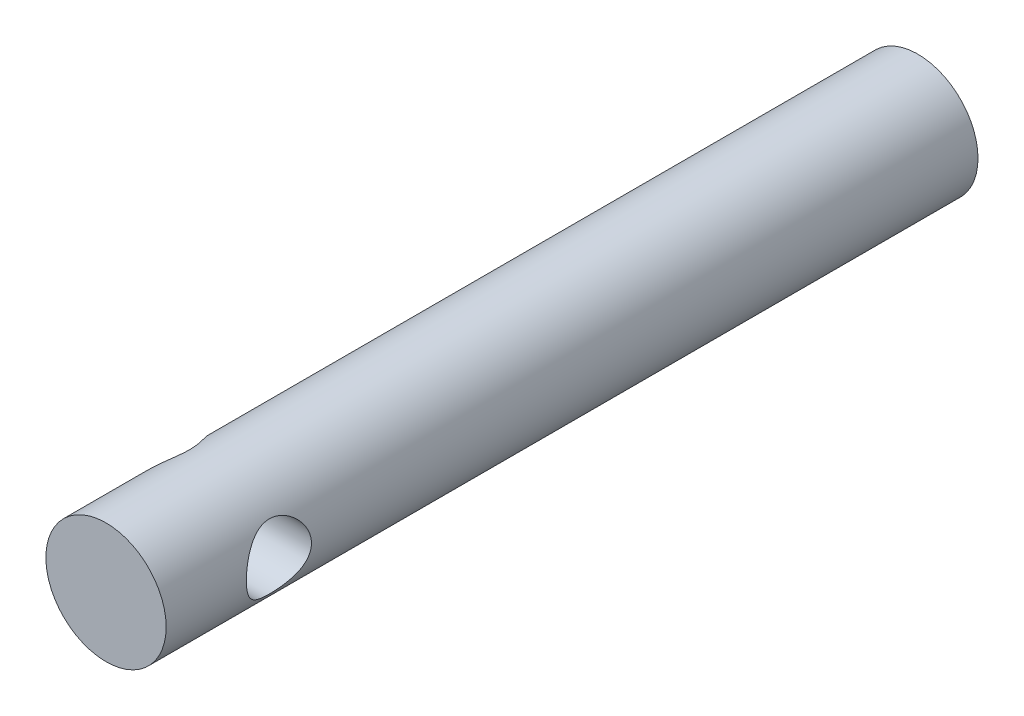
ISO-10303-21;
HEADER;
FILE_DESCRIPTION(('STEP AP214'),'2;1');
FILE_NAME('part.step','',(''),(''),'','','');
FILE_SCHEMA(('AUTOMOTIVE_DESIGN { 1 0 10303 214 1 1 1 1 }'));
ENDSEC;
DATA;
#1=APPLICATION_CONTEXT('core data for automotive mechanical design processes');
#2=APPLICATION_PROTOCOL_DEFINITION('international standard','automotive_design',2000,#1);
#3=PRODUCT_CONTEXT('',#1,'mechanical');
#4=PRODUCT('Part','Part','',(#3));
#5=PRODUCT_RELATED_PRODUCT_CATEGORY('part','',(#4));
#6=PRODUCT_DEFINITION_FORMATION('','',#4);
#7=PRODUCT_DEFINITION_CONTEXT('part definition',#1,'design');
#8=PRODUCT_DEFINITION('design','',#6,#7);
#9=PRODUCT_DEFINITION_SHAPE('','',#8);
#10=(LENGTH_UNIT() NAMED_UNIT(*) SI_UNIT(.MILLI.,.METRE.));
#11=(NAMED_UNIT(*) PLANE_ANGLE_UNIT() SI_UNIT($,.RADIAN.));
#12=(NAMED_UNIT(*) SI_UNIT($,.STERADIAN.) SOLID_ANGLE_UNIT());
#13=UNCERTAINTY_MEASURE_WITH_UNIT(LENGTH_MEASURE(1.E-05),#10,'distance_accuracy_value','');
#14=(GEOMETRIC_REPRESENTATION_CONTEXT(3) GLOBAL_UNCERTAINTY_ASSIGNED_CONTEXT((#13)) GLOBAL_UNIT_ASSIGNED_CONTEXT((#10,
#11,#12)) REPRESENTATION_CONTEXT('',''));
#15=CARTESIAN_POINT('',(0.,0.,0.));
#16=DIRECTION('',(0.,0.,1.));
#17=DIRECTION('',(1.,0.,0.));
#18=AXIS2_PLACEMENT_3D('',#15,#16,#17);
#19=CARTESIAN_POINT('',(0.,0.,54.002621));
#20=DIRECTION('',(0.,0.,-1.));
#21=DIRECTION('',(-1.,0.,0.));
#22=AXIS2_PLACEMENT_3D('',#19,#20,#21);
#23=CYLINDRICAL_SURFACE('',#22,4.);
#24=CARTESIAN_POINT('',(-4.,0.,43.002621));
#25=CARTESIAN_POINT('',(-4.00000085772761,0.0818621934049827,43.0026201314348));
#26=CARTESIAN_POINT('',(-3.99748244174744,0.163714705983274,43.0054973968069));
#27=CARTESIAN_POINT('',(-3.98746914532093,0.326742379033557,43.0169477532282));
#28=CARTESIAN_POINT('',(-3.97997260849931,0.407917304945504,43.0255227400867));
#29=CARTESIAN_POINT('',(-3.96015888859826,0.568971546800882,43.0482195530344));
#30=CARTESIAN_POINT('',(-3.94783700306273,0.648849519497851,43.0623467900167));
#31=CARTESIAN_POINT('',(-3.91864341845221,0.806652383977214,43.095887526278));
#32=CARTESIAN_POINT('',(-3.90176965655422,0.884576372709485,43.1153034223146));
#33=CARTESIAN_POINT('',(-3.84506544054264,1.11355611356371,43.1807224689403));
#34=CARTESIAN_POINT('',(-3.79899165820658,1.2610610791802,43.2340789218782));
#35=CARTESIAN_POINT('',(-3.6933293852557,1.54342201711665,43.3575155504573));
#36=CARTESIAN_POINT('',(-3.63373761908528,1.67827491248749,43.4275997796371));
#37=CARTESIAN_POINT('',(-3.47904116809295,1.98388463557385,43.6117458778255));
#38=CARTESIAN_POINT('',(-3.37912046337253,2.14832350975532,43.7323282477662));
#39=CARTESIAN_POINT('',(-3.2203513821037,2.37442756642791,43.9292661510598));
#40=CARTESIAN_POINT('',(-3.16584241699134,2.44647929376403,43.997725257969));
#41=CARTESIAN_POINT('',(-3.0547975332481,2.58379292802496,44.1396258861526));
#42=CARTESIAN_POINT('',(-2.99826231292997,2.64905714445804,44.213065698555));
#43=CARTESIAN_POINT('',(-2.88292909880932,2.77418829686192,44.366296304374));
#44=CARTESIAN_POINT('',(-2.82410862509739,2.83390736211394,44.4461903387192));
#45=CARTESIAN_POINT('',(-2.70655661597358,2.94638173015013,44.610854856262));
#46=CARTESIAN_POINT('',(-2.64782511429152,2.99913484021749,44.6956268629303));
#47=CARTESIAN_POINT('',(-2.5320265932133,3.09751475832117,44.870012878925));
#48=CARTESIAN_POINT('',(-2.47495654489938,3.14315529341411,44.959617100558));
#49=CARTESIAN_POINT('',(-2.36431437004018,3.22720239060098,45.1441523453221));
#50=CARTESIAN_POINT('',(-2.31073960429601,3.26561445301637,45.2390792463181));
#51=CARTESIAN_POINT('',(-2.20824042901063,3.33581131958539,45.4378183292441));
#52=CARTESIAN_POINT('',(-2.15950164698474,3.36736512220133,45.5418107751774));
#53=CARTESIAN_POINT('',(-2.07295066290575,3.42132749222826,45.7564887089912));
#54=CARTESIAN_POINT('',(-2.03511741379875,3.44375371030445,45.8671607992245));
#55=CARTESIAN_POINT('',(-1.98054459291129,3.4753848632344,46.0770229644378));
#56=CARTESIAN_POINT('',(-1.96145008851326,3.48609653036212,46.1753475366131));
#57=CARTESIAN_POINT('',(-1.93824342534288,3.49905847370086,46.3742524068101));
#58=CARTESIAN_POINT('',(-1.93410769125094,3.50132206442789,46.4748289037743));
#59=CARTESIAN_POINT('',(-1.94158048949444,3.49718071290139,46.6751849067527));
#60=CARTESIAN_POINT('',(-1.95319003017406,3.49077521547028,46.7749643613118));
#61=CARTESIAN_POINT('',(-1.9900193976504,3.46990717541946,46.9711560435635));
#62=CARTESIAN_POINT('',(-2.0152663837858,3.45542855309201,47.0675611417926));
#63=CARTESIAN_POINT('',(-2.09409657445041,3.40850151328472,47.3123927313464));
#64=CARTESIAN_POINT('',(-2.15558633182772,3.37048182938313,47.457129635331));
#65=CARTESIAN_POINT('',(-2.2921879621424,3.27912749319544,47.7350501428085));
#66=CARTESIAN_POINT('',(-2.3673564559854,3.22572862491022,47.8681821889423));
#67=CARTESIAN_POINT('',(-2.50836700690803,3.11680039214331,48.099005151705));
#68=CARTESIAN_POINT('',(-2.57315251633025,3.06373637515746,48.1985307412952));
#69=CARTESIAN_POINT('',(-2.70416241274077,2.94874623516264,48.3914082994966));
#70=CARTESIAN_POINT('',(-2.77038758818973,2.88681514664712,48.4847567658394));
#71=CARTESIAN_POINT('',(-2.90225555114372,2.75420602097083,48.6652265084233));
#72=CARTESIAN_POINT('',(-2.96789897529072,2.68353927465852,48.7523555980112));
#73=CARTESIAN_POINT('',(-3.09711380088955,2.5333199366156,48.9202603930045));
#74=CARTESIAN_POINT('',(-3.16068501692741,2.45376655254347,49.0010355307891));
#75=CARTESIAN_POINT('',(-3.31798857172082,2.23984677032379,49.1978437943216));
#76=CARTESIAN_POINT('',(-3.40930832172733,2.09921068585916,49.3091432422145));
#77=CARTESIAN_POINT('',(-3.577902822894,1.79679761433804,49.5116915638823));
#78=CARTESIAN_POINT('',(-3.655201735847,1.63505783820173,49.6029749886494));
#79=CARTESIAN_POINT('',(-3.77725507318458,1.32463709298029,49.7458841392144));
#80=CARTESIAN_POINT('',(-3.82539857267597,1.17925632769141,49.8017434462368));
#81=CARTESIAN_POINT('',(-3.90549835673989,0.878225806064525,49.8942957657615));
#82=CARTESIAN_POINT('',(-3.93746418388982,0.722582164785564,49.9310000774472));
#83=CARTESIAN_POINT('',(-3.98279099715188,0.404164624887113,49.9829641021755));
#84=CARTESIAN_POINT('',(-3.99605227499647,0.241357248735737,49.9981088919043));
#85=CARTESIAN_POINT('',(-4.002422696899,-0.0851582297835957,50.0053901679191));
#86=CARTESIAN_POINT('',(-3.99553627118732,-0.24886612623726,49.9975317123334));
#87=CARTESIAN_POINT('',(-3.96372598390911,-0.557564956824129,49.9611164421409));
#88=CARTESIAN_POINT('',(-3.94041187647704,-0.702951007017499,49.9344065287623));
#89=CARTESIAN_POINT('',(-3.87920809267354,-0.986292477078758,49.8639537876478));
#90=CARTESIAN_POINT('',(-3.84131437700799,-1.1242458256239,49.8202062395781));
#91=CARTESIAN_POINT('',(-3.75029728058316,-1.39914887689686,49.7143980096769));
#92=CARTESIAN_POINT('',(-3.69632622087078,-1.53541704749804,49.6513099238181));
#93=CARTESIAN_POINT('',(-3.57746207626662,-1.79504895897756,49.5108790629177));
#94=CARTESIAN_POINT('',(-3.51256781028195,-1.91841130204678,49.4335347463074));
#95=CARTESIAN_POINT('',(-3.33915651462831,-2.21180304240458,49.223855933189));
#96=CARTESIAN_POINT('',(-3.22536706101213,-2.37321056302709,49.0836957167037));
#97=CARTESIAN_POINT('',(-3.04774707104853,-2.592334701048,48.8565469902964));
#98=CARTESIAN_POINT('',(-2.98718634231648,-2.66172344265734,48.7777425683776));
#99=CARTESIAN_POINT('',(-2.86499592767594,-2.79281253246313,48.6147579499671));
#100=CARTESIAN_POINT('',(-2.80336669678108,-2.85451606598047,48.5305800026917));
#101=CARTESIAN_POINT('',(-2.67899392837794,-2.971608365322,48.3549043100503));
#102=CARTESIAN_POINT('',(-2.61625765344644,-3.02681771633628,48.2632821646832));
#103=CARTESIAN_POINT('',(-2.49289268536987,-3.1292023316798,48.0741388800208));
#104=CARTESIAN_POINT('',(-2.43226584565961,-3.17637066598925,47.976612749571));
#105=CARTESIAN_POINT('',(-2.31612488943486,-3.26201311828534,47.775848694934));
#106=CARTESIAN_POINT('',(-2.26057937269803,-3.30054311994524,47.6726532000396));
#107=CARTESIAN_POINT('',(-2.15795158976798,-3.36853359142237,47.4594211681569));
#108=CARTESIAN_POINT('',(-2.11085104814635,-3.39801374663776,47.3494001144738));
#109=CARTESIAN_POINT('',(-2.03595690912713,-3.44333262276847,47.1378151036951));
#110=CARTESIAN_POINT('',(-2.00639427170547,-3.46049389507178,47.0371851089433));
#111=CARTESIAN_POINT('',(-1.96174204177059,-3.48600839253299,46.831831348276));
#112=CARTESIAN_POINT('',(-1.9466070361188,-3.49438926362766,46.7271215147611));
#113=CARTESIAN_POINT('',(-1.93364464032376,-3.50158437799306,46.5155083173685));
#114=CARTESIAN_POINT('',(-1.9359364647634,-3.5003327257726,46.4085948433422));
#115=CARTESIAN_POINT('',(-1.9576148309214,-3.48824783089892,46.1969697576285));
#116=CARTESIAN_POINT('',(-1.9770387068084,-3.47739366228402,46.0922634663697));
#117=CARTESIAN_POINT('',(-2.03804728618704,-3.44208333242692,45.8537151751148));
#118=CARTESIAN_POINT('',(-2.08485290493113,-3.4143045939362,45.721760921609));
#119=CARTESIAN_POINT('',(-2.1928266577146,-3.34598071550997,45.4672918547801));
#120=CARTESIAN_POINT('',(-2.25404558569621,-3.30539024936766,45.3448125080778));
#121=CARTESIAN_POINT('',(-2.37522509579982,-3.21917563648211,45.1246167836032));
#122=CARTESIAN_POINT('',(-2.43423106607182,-3.17497997872461,45.0257943927648));
#123=CARTESIAN_POINT('',(-2.55515423912989,-3.07850179375504,44.8339801173349));
#124=CARTESIAN_POINT('',(-2.61707329909487,-3.0262140576206,44.7409920429008));
#125=CARTESIAN_POINT('',(-2.74186115309384,-2.91363624110074,44.5604440180389));
#126=CARTESIAN_POINT('',(-2.80473113232417,-2.85333529285625,44.472891680685));
#127=CARTESIAN_POINT('',(-2.92977504954837,-2.7247861516838,44.3033361136393));
#128=CARTESIAN_POINT('',(-2.99194915413138,-2.65653990744561,44.2213315310553));
#129=CARTESIAN_POINT('',(-3.11647528455446,-2.50942199250466,44.0602622935759));
#130=CARTESIAN_POINT('',(-3.17875438106805,-2.430257918113,43.9814071924079));
#131=CARTESIAN_POINT('',(-3.2997815872536,-2.26320260809446,43.8304324267359));
#132=CARTESIAN_POINT('',(-3.3585288475311,-2.17530928648543,43.758314380179));
#133=CARTESIAN_POINT('',(-3.47089946392871,-1.99109313165177,43.6218861900467));
#134=CARTESIAN_POINT('',(-3.52453793649976,-1.89479689199776,43.5575528490697));
#135=CARTESIAN_POINT('',(-3.62537949251121,-1.69389099316241,43.4375877170332));
#136=CARTESIAN_POINT('',(-3.67258725947175,-1.58928747307154,43.3819495888035));
#137=CARTESIAN_POINT('',(-3.77084592867248,-1.34265225587126,43.2668191983247));
#138=CARTESIAN_POINT('',(-3.81947055057782,-1.198160405033,43.2103695343483));
#139=CARTESIAN_POINT('',(-3.88038721113852,-0.973968292245461,43.1399526250805));
#140=CARTESIAN_POINT('',(-3.89868293366776,-0.898036987556782,43.1188639183853));
#141=CARTESIAN_POINT('',(-3.93097273579559,-0.744062919203225,43.0817099852478));
#142=CARTESIAN_POINT('',(-3.94496805718647,-0.666020772164958,43.065643308611));
#143=CARTESIAN_POINT('',(-3.97094929644225,-0.49094081099766,43.0358497212261));
#144=CARTESIAN_POINT('',(-3.98181119317095,-0.393509807836521,43.0234204610694));
#145=CARTESIAN_POINT('',(-3.99633693731906,-0.197381389505155,43.0068055825258));
#146=CARTESIAN_POINT('',(-3.99999896602208,-0.0986836606904702,43.0026220470424));
#147=CARTESIAN_POINT('',(-4.,0.,43.002621));
#148=B_SPLINE_CURVE_WITH_KNOTS('',3,(#24,#25,#26,#27,#28,#29,#30,#31,#32,#33,#34,#35,#36,#37,
#38,#39,#40,#41,#42,#43,#44,#45,#46,#47,#48,#49,#50,#51,#52,#53,#54,#55,#56,#57,#58,#59,#60,#61,
#62,#63,#64,#65,#66,#67,#68,#69,#70,#71,#72,#73,#74,#75,#76,#77,#78,#79,#80,#81,#82,#83,#84,#85,
#86,#87,#88,#89,#90,#91,#92,#93,#94,#95,#96,#97,#98,#99,#100,#101,#102,#103,#104,#105,#106,#107,
#108,#109,#110,#111,#112,#113,#114,#115,#116,#117,#118,#119,#120,#121,#122,#123,#124,#125,#126,
#127,#128,#129,#130,#131,#132,#133,#134,#135,#136,#137,#138,#139,#140,#141,#142,#143,#144,#145,
#146,#147),.UNSPECIFIED.,.T.,.F.,(4,2,2,2,2,2,2,2,2,2,2,2,2,2,2,2,2,2,2,2,2,2,2,2,2,2,2,2,2,2,2,
2,2,2,2,2,2,2,2,2,2,2,2,2,2,2,2,2,2,2,2,2,2,2,2,2,2,2,2,2,2,4),(0.,0.245481072043838,
0.491043864212012,0.736846563072527,0.982760842677705,1.47084490610424,1.95904736421989,
2.63629814362263,2.97613097489283,3.31584779421793,3.66293718948613,4.01013558110324,
4.35665536243192,4.70291039266947,5.05946043078581,5.41531766859937,5.71623095411374,
6.016669787153,6.31712786152371,6.61818652430512,7.10080570552536,7.58547003437397,
7.97521585025116,8.36518078133394,8.75464685129464,9.14414767419832,9.74560910356865,
10.3460239911683,10.833075282535,11.3198389455307,11.8091877154162,12.2984288916581,
12.7454018494831,13.1924987308592,13.6694365433232,14.1464259587807,14.86868850672,
15.232073852625,15.5953080798777,15.9669575005835,16.3389256195678,16.7084130931864,
17.0770910605803,17.3947939837881,17.7114935546895,18.0303615637397,18.3499261715993,
18.7757415505113,19.2030806204559,19.5724839578971,19.9421260793286,20.3122747415167,
20.6823328103089,21.0656054983347,21.4489699963978,21.8311624137208,22.2130749726381,
22.6984996112005,22.9409576507422,23.1833456116863,23.4791946821217,23.7751184756568),.UNSPECIFIED.);
#149=CARTESIAN_POINT('',(-4.,0.,43.002621));
#150=VERTEX_POINT('',#149);
#151=EDGE_CURVE('E10',#150,#150,#148,.T.);
#152=ORIENTED_EDGE('',*,*,#151,.T.);
#153=EDGE_LOOP('',(#152));
#154=FACE_BOUND('',#153,.T.);
#155=CARTESIAN_POINT('',(4.,0.,44.337621));
#156=CARTESIAN_POINT('',(3.9999923668125,-0.112658809052639,44.3376297494284));
#157=CARTESIAN_POINT('',(3.99519099909822,-0.225422276943508,44.3464664457588));
#158=CARTESIAN_POINT('',(3.97645379714378,-0.447540861995911,44.3813907546054));
#159=CARTESIAN_POINT('',(3.96250460877713,-0.556890751106725,44.4075035875801));
#160=CARTESIAN_POINT('',(3.92691501463235,-0.76864995519338,44.4756222049955));
#161=CARTESIAN_POINT('',(3.90530603234515,-0.871085620992647,44.5175631012727));
#162=CARTESIAN_POINT('',(3.85631573223975,-1.067271308195,44.6157707882885));
#163=CARTESIAN_POINT('',(3.82893428146025,-1.16102112945935,44.6720379090194));
#164=CARTESIAN_POINT('',(3.7686654509825,-1.34427680746424,44.8015704442559));
#165=CARTESIAN_POINT('',(3.73553138900384,-1.43307101672415,44.8757257803161));
#166=CARTESIAN_POINT('',(3.66817209708606,-1.59763430037185,45.0369888876137));
#167=CARTESIAN_POINT('',(3.63394591383836,-1.67339160454985,45.124108232317));
#168=CARTESIAN_POINT('',(3.56449123152665,-1.81695990104654,45.3186218246878));
#169=CARTESIAN_POINT('',(3.52947443688475,-1.88334028041105,45.4271545909252));
#170=CARTESIAN_POINT('',(3.46664069473575,-1.99665624083759,45.6559721416333));
#171=CARTESIAN_POINT('',(3.43881812146482,-2.04360703287718,45.7762476414614));
#172=CARTESIAN_POINT('',(3.40661637290468,-2.09650788500104,45.9589424894102));
#173=CARTESIAN_POINT('',(3.39763215861587,-2.11099318261858,46.0181873531778));
#174=CARTESIAN_POINT('',(3.38262821566105,-2.13495420952504,46.1380371252358));
#175=CARTESIAN_POINT('',(3.37660677252353,-2.14443283626618,46.1986412256933));
#176=CARTESIAN_POINT('',(3.36781899877691,-2.1582083308696,46.3206182738664));
#177=CARTESIAN_POINT('',(3.36504979051031,-2.16250977971017,46.3819904932537));
#178=CARTESIAN_POINT('',(3.36288474020594,-2.16587293858969,46.5049170548631));
#179=CARTESIAN_POINT('',(3.36348846521824,-2.16493532111552,46.5664713726973));
#180=CARTESIAN_POINT('',(3.36968053282409,-2.15530425590572,46.7325160682275));
#181=CARTESIAN_POINT('',(3.3784860425764,-2.14160417580592,46.8366496356395));
#182=CARTESIAN_POINT('',(3.40471061813774,-2.09965071692565,47.0407488661499));
#183=CARTESIAN_POINT('',(3.42213335720632,-2.0713911316621,47.1407127321115));
#184=CARTESIAN_POINT('',(3.46392813801624,-2.00072839838396,47.3365169459441));
#185=CARTESIAN_POINT('',(3.48844512496575,-1.95802674061385,47.4322175133765));
#186=CARTESIAN_POINT('',(3.54171350829855,-1.85993994195307,47.6155793632378));
#187=CARTESIAN_POINT('',(3.57046675928352,-1.80454923997943,47.7032370971655));
#188=CARTESIAN_POINT('',(3.63422833572878,-1.67287403194261,47.8820576960107));
#189=CARTESIAN_POINT('',(3.66952306162063,-1.59469332350256,47.9717275773753));
#190=CARTESIAN_POINT('',(3.73891790539474,-1.42441291169162,48.1373664729618));
#191=CARTESIAN_POINT('',(3.77301724180041,-1.33230430464917,48.2133266543683));
#192=CARTESIAN_POINT('',(3.83877708901886,-1.12952983720028,48.353983242914));
#193=CARTESIAN_POINT('',(3.87014833680032,-1.01806016347064,48.4176676902716));
#194=CARTESIAN_POINT('',(3.92427401782457,-0.783877750527542,48.5248220570655));
#195=CARTESIAN_POINT('',(3.94703633490336,-0.661175426436592,48.5683104798582));
#196=CARTESIAN_POINT('',(3.9795748529621,-0.420013501567231,48.6297911786047));
#197=CARTESIAN_POINT('',(3.99034831758565,-0.302192172639198,48.6497514723329));
#198=CARTESIAN_POINT('',(4.00124759379957,-0.0644068283796612,48.6699435869023));
#199=CARTESIAN_POINT('',(4.00137986187467,0.0555558435041637,48.6701873706229));
#200=CARTESIAN_POINT('',(3.99149583927251,0.282166721887291,48.6518781091879));
#201=CARTESIAN_POINT('',(3.9824324468213,0.389006404483187,48.6350900015825));
#202=CARTESIAN_POINT('',(3.95643708821671,0.598085540052388,48.5861393672018));
#203=CARTESIAN_POINT('',(3.93950431435054,0.700324519628062,48.5539752622254));
#204=CARTESIAN_POINT('',(3.89875665579742,0.900197651076476,48.4746031105468));
#205=CARTESIAN_POINT('',(3.87478746743455,0.997664138579951,48.4270550128057));
#206=CARTESIAN_POINT('',(3.82212784187867,1.1835040650741,48.3186956794603));
#207=CARTESIAN_POINT('',(3.79343561660579,1.2718740395705,48.257879417855));
#208=CARTESIAN_POINT('',(3.73025904765831,1.44733759136326,48.1170695791107));
#209=CARTESIAN_POINT('',(3.69548461762647,1.53322670345689,48.0357038388948));
#210=CARTESIAN_POINT('',(3.62611688500666,1.69076949607905,47.8599963487906));
#211=CARTESIAN_POINT('',(3.59152379242503,1.76240919518689,47.7656420066416));
#212=CARTESIAN_POINT('',(3.52376285638243,1.89446416969,47.5582740619199));
#213=CARTESIAN_POINT('',(3.49087810729715,1.95369605522143,47.4444052222105));
#214=CARTESIAN_POINT('',(3.43428230795495,2.05156961738808,47.2060562284369));
#215=CARTESIAN_POINT('',(3.41055803101299,2.09024101171071,47.0815916929105));
#216=CARTESIAN_POINT('',(3.37823651361237,2.14204857924992,46.8384120748534));
#217=CARTESIAN_POINT('',(3.36838825905218,2.15730965600414,46.7203225382933));
#218=CARTESIAN_POINT('',(3.36141838042687,2.1681617135773,46.4829029765422));
#219=CARTESIAN_POINT('',(3.36428707835559,2.16376765255951,46.3635739636108));
#220=CARTESIAN_POINT('',(3.38102083716985,2.13749218712957,46.1433856171116));
#221=CARTESIAN_POINT('',(3.39342718414183,2.11792778496293,46.042121568498));
#222=CARTESIAN_POINT('',(3.42583735027688,2.06508921300746,45.8445191627558));
#223=CARTESIAN_POINT('',(3.44584411906834,2.03180972013804,45.7481827344652));
#224=CARTESIAN_POINT('',(3.49270658979873,1.95021498967957,45.5563474169166));
#225=CARTESIAN_POINT('',(3.51991472439399,1.90108369269216,45.4612847224794));
#226=CARTESIAN_POINT('',(3.57769630533629,1.78997546045116,45.2801148928562));
#227=CARTESIAN_POINT('',(3.60827155235517,1.72799163609856,45.1940125978715));
#228=CARTESIAN_POINT('',(3.67483797782471,1.5820592523962,45.0196862280349));
#229=CARTESIAN_POINT('',(3.71095208027748,1.49620926766504,44.9330907801714));
#230=CARTESIAN_POINT('',(3.78052299405614,1.31053283576637,44.7750162832688));
#231=CARTESIAN_POINT('',(3.81397798986596,1.21069696599488,44.7035475075961));
#232=CARTESIAN_POINT('',(3.87573262977227,0.995738400618202,44.5760331293316));
#233=CARTESIAN_POINT('',(3.90385409168761,0.880255625400697,44.5204963967374));
#234=CARTESIAN_POINT('',(3.93874782342058,0.700025481535513,44.4529092737388));
#235=CARTESIAN_POINT('',(3.94916034114737,0.638819127486698,44.4330069839173));
#236=CARTESIAN_POINT('',(3.96726702570932,0.514514197118954,44.3986607384248));
#237=CARTESIAN_POINT('',(3.97496266023128,0.45141666248326,44.3842138354062));
#238=CARTESIAN_POINT('',(3.98737543959544,0.323936152262266,44.3610131393242));
#239=CARTESIAN_POINT('',(3.99209460057994,0.259554077332736,44.352255492469));
#240=CARTESIAN_POINT('',(3.99840908787931,0.1301263109315,44.3405568912857));
#241=CARTESIAN_POINT('',(4.00000440953147,0.065080618469408,44.3376159456397));
#242=CARTESIAN_POINT('',(4.,0.,44.337621));
#243=B_SPLINE_CURVE_WITH_KNOTS('',3,(#155,#156,#157,#158,#159,#160,#161,#162,#163,#164,#165,
#166,#167,#168,#169,#170,#171,#172,#173,#174,#175,#176,#177,#178,#179,#180,#181,#182,#183,#184,
#185,#186,#187,#188,#189,#190,#191,#192,#193,#194,#195,#196,#197,#198,#199,#200,#201,#202,#203,
#204,#205,#206,#207,#208,#209,#210,#211,#212,#213,#214,#215,#216,#217,#218,#219,#220,#221,#222,
#223,#224,#225,#226,#227,#228,#229,#230,#231,#232,#233,#234,#235,#236,#237,#238,#239,#240,#241,
#242),.UNSPECIFIED.,.T.,.F.,(4,2,2,2,2,2,2,2,2,2,2,2,2,2,2,2,2,2,2,2,2,2,2,2,2,2,2,2,2,2,2,2,2,
2,2,2,2,2,2,2,2,2,2,4),(0.,0.337723922081779,0.675941959391931,1.01278825224654,
1.34964230476462,1.70919475937521,2.06907014757691,2.46300472887682,2.85663032173117,
3.04133596100406,3.22593459029697,3.41036975882293,3.59478125378297,3.9093402020428,
4.22403335281168,4.54567485962661,4.86745759919633,5.23815853333939,5.60909745480205,
6.00342076689394,6.39738208845537,6.75531355217395,7.11302784139896,7.4371133683472,
7.7612321667617,8.09307037188596,8.42503449676655,8.79343102188526,9.16218725096548,
9.55755981799479,9.95235935776651,10.3086036236213,10.6645768227982,10.9748586593406,
11.2852610355907,11.6152443555948,11.9454050097203,12.3252231451859,12.7052984144176,
13.096424851756,13.2917586143451,13.486986693684,13.6820823910298,13.8771783795799),.UNSPECIFIED.);
#244=CARTESIAN_POINT('',(4.,0.,44.337621));
#245=VERTEX_POINT('',#244);
#246=EDGE_CURVE('E60',#245,#245,#243,.T.);
#247=ORIENTED_EDGE('',*,*,#246,.T.);
#248=EDGE_LOOP('',(#247));
#249=FACE_BOUND('',#248,.T.);
#250=CARTESIAN_POINT('',(0.,0.,54.002621));
#251=DIRECTION('',(0.,0.,1.));
#252=DIRECTION('',(1.,0.,0.));
#253=AXIS2_PLACEMENT_3D('',#250,#251,#252);
#254=CIRCLE('',#253,4.);
#255=CARTESIAN_POINT('',(4.,0.,54.002621));
#256=VERTEX_POINT('',#255);
#257=EDGE_CURVE('E49',#256,#256,#254,.T.);
#258=ORIENTED_EDGE('',*,*,#257,.F.);
#259=EDGE_LOOP('',(#258));
#260=FACE_BOUND('',#259,.T.);
#261=CARTESIAN_POINT('',(0.,0.,0.));
#262=DIRECTION('',(0.,0.,1.));
#263=DIRECTION('',(1.,0.,0.));
#264=AXIS2_PLACEMENT_3D('',#261,#262,#263);
#265=CIRCLE('',#264,4.);
#266=CARTESIAN_POINT('',(4.,0.,0.));
#267=VERTEX_POINT('',#266);
#268=EDGE_CURVE('E54',#267,#267,#265,.T.);
#269=ORIENTED_EDGE('',*,*,#268,.T.);
#270=EDGE_LOOP('',(#269));
#271=FACE_BOUND('',#270,.T.);
#272=ADVANCED_FACE('F37',(#154,#249,#260,#271),#23,.T.);
#273=CARTESIAN_POINT('',(0.,0.,54.002621));
#274=DIRECTION('',(0.,0.,1.));
#275=DIRECTION('',(1.,0.,0.));
#276=AXIS2_PLACEMENT_3D('',#273,#274,#275);
#277=PLANE('',#276);
#278=ORIENTED_EDGE('',*,*,#257,.T.);
#279=EDGE_LOOP('',(#278));
#280=FACE_BOUND('',#279,.T.);
#281=ADVANCED_FACE('F81',(#280),#277,.T.);
#282=CARTESIAN_POINT('',(0.,0.,0.));
#283=DIRECTION('',(0.,0.,1.));
#284=DIRECTION('',(1.,0.,0.));
#285=AXIS2_PLACEMENT_3D('',#282,#283,#284);
#286=PLANE('',#285);
#287=ORIENTED_EDGE('',*,*,#268,.F.);
#288=EDGE_LOOP('',(#287));
#289=FACE_BOUND('',#288,.T.);
#290=ADVANCED_FACE('F77',(#289),#286,.F.);
#291=CARTESIAN_POINT('',(-9.,0.,46.502621));
#292=DIRECTION('',(1.,0.,0.));
#293=DIRECTION('',(0.,0.,-1.));
#294=AXIS2_PLACEMENT_3D('',#291,#292,#293);
#295=CYLINDRICAL_SURFACE('',#294,2.165);
#296=CARTESIAN_POINT('',(0.,0.,46.502621));
#297=DIRECTION('',(1.,0.,0.));
#298=DIRECTION('',(0.,0.,-1.));
#299=AXIS2_PLACEMENT_3D('',#296,#297,#298);
#300=CIRCLE('',#299,2.165);
#301=CARTESIAN_POINT('',(0.,0.,44.337621));
#302=VERTEX_POINT('',#301);
#303=EDGE_CURVE('E71',#302,#302,#300,.F.);
#304=ORIENTED_EDGE('',*,*,#303,.T.);
#305=EDGE_LOOP('',(#304));
#306=FACE_BOUND('',#305,.T.);
#307=ORIENTED_EDGE('',*,*,#246,.F.);
#308=EDGE_LOOP('',(#307));
#309=FACE_BOUND('',#308,.T.);
#310=ADVANCED_FACE('F72',(#306,#309),#295,.F.);
#311=CARTESIAN_POINT('',(-4.,0.,46.502621));
#312=DIRECTION('',(1.,0.,0.));
#313=DIRECTION('',(0.,0.,-1.));
#314=AXIS2_PLACEMENT_3D('',#311,#312,#313);
#315=CYLINDRICAL_SURFACE('',#314,3.5);
#316=CARTESIAN_POINT('',(0.,0.,46.502621));
#317=DIRECTION('',(1.,0.,0.));
#318=DIRECTION('',(0.,0.,-1.));
#319=AXIS2_PLACEMENT_3D('',#316,#317,#318);
#320=CIRCLE('',#319,3.5);
#321=CARTESIAN_POINT('',(0.,0.,43.002621));
#322=VERTEX_POINT('',#321);
#323=EDGE_CURVE('E63',#322,#322,#320,.T.);
#324=ORIENTED_EDGE('',*,*,#323,.T.);
#325=EDGE_LOOP('',(#324));
#326=FACE_BOUND('',#325,.T.);
#327=ORIENTED_EDGE('',*,*,#151,.F.);
#328=EDGE_LOOP('',(#327));
#329=FACE_BOUND('',#328,.T.);
#330=ADVANCED_FACE('F76',(#326,#329),#315,.F.);
#331=CARTESIAN_POINT('',(0.,0.,46.502621));
#332=DIRECTION('',(1.,0.,0.));
#333=DIRECTION('',(0.,0.,-1.));
#334=AXIS2_PLACEMENT_3D('',#331,#332,#333);
#335=PLANE('',#334);
#336=ORIENTED_EDGE('',*,*,#323,.F.);
#337=EDGE_LOOP('',(#336));
#338=FACE_BOUND('',#337,.T.);
#339=ORIENTED_EDGE('',*,*,#303,.F.);
#340=EDGE_LOOP('',(#339));
#341=FACE_BOUND('',#340,.T.);
#342=ADVANCED_FACE('F119',(#338,#341),#335,.F.);
#343=CLOSED_SHELL('',(#272,#281,#290,#310,#330,#342));
#344=MANIFOLD_SOLID_BREP('B2',#343);
#345=ADVANCED_BREP_SHAPE_REPRESENTATION('',(#18,#344),#14);
#346=SHAPE_DEFINITION_REPRESENTATION(#9,#345);
ENDSEC;
END-ISO-10303-21;
